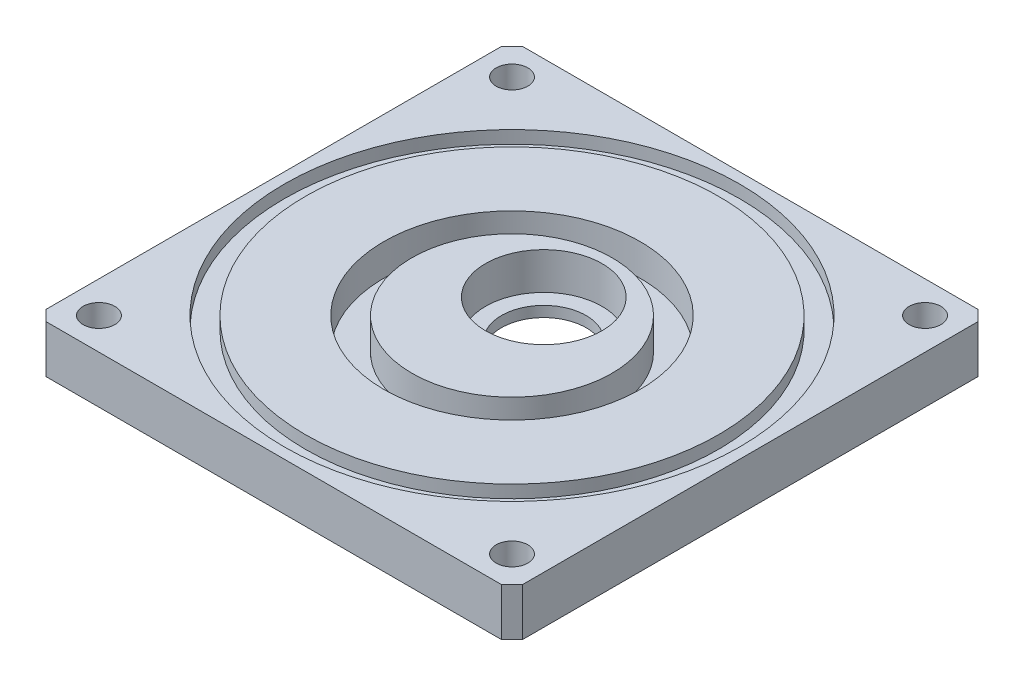
ISO-10303-21;
HEADER;
FILE_DESCRIPTION(('STEP AP214'),'2;1');
FILE_NAME('part.step','',(''),(''),'','','');
FILE_SCHEMA(('AUTOMOTIVE_DESIGN { 1 0 10303 214 1 1 1 1 }'));
ENDSEC;
DATA;
#1=APPLICATION_CONTEXT('core data for automotive mechanical design processes');
#2=APPLICATION_PROTOCOL_DEFINITION('international standard','automotive_design',2000,#1);
#3=PRODUCT_CONTEXT('',#1,'mechanical');
#4=PRODUCT('Part','Part','',(#3));
#5=PRODUCT_RELATED_PRODUCT_CATEGORY('part','',(#4));
#6=PRODUCT_DEFINITION_FORMATION('','',#4);
#7=PRODUCT_DEFINITION_CONTEXT('part definition',#1,'design');
#8=PRODUCT_DEFINITION('design','',#6,#7);
#9=PRODUCT_DEFINITION_SHAPE('','',#8);
#10=(LENGTH_UNIT() NAMED_UNIT(*) SI_UNIT(.MILLI.,.METRE.));
#11=(NAMED_UNIT(*) PLANE_ANGLE_UNIT() SI_UNIT($,.RADIAN.));
#12=(NAMED_UNIT(*) SI_UNIT($,.STERADIAN.) SOLID_ANGLE_UNIT());
#13=UNCERTAINTY_MEASURE_WITH_UNIT(LENGTH_MEASURE(1.E-05),#10,'distance_accuracy_value','');
#14=(GEOMETRIC_REPRESENTATION_CONTEXT(3) GLOBAL_UNCERTAINTY_ASSIGNED_CONTEXT((#13)) GLOBAL_UNIT_ASSIGNED_CONTEXT((#10,
#11,#12)) REPRESENTATION_CONTEXT('',''));
#15=CARTESIAN_POINT('',(0.,0.,0.));
#16=DIRECTION('',(0.,0.,1.));
#17=DIRECTION('',(1.,0.,0.));
#18=AXIS2_PLACEMENT_3D('',#15,#16,#17);
#19=CARTESIAN_POINT('',(0.,4.5,0.));
#20=DIRECTION('',(0.,-1.,0.));
#21=DIRECTION('',(0.,0.,-1.));
#22=AXIS2_PLACEMENT_3D('',#19,#20,#21);
#23=PLANE('',#22);
#24=CARTESIAN_POINT('',(0.,4.5,0.));
#25=DIRECTION('',(0.,1.,0.));
#26=DIRECTION('',(0.,0.,1.));
#27=AXIS2_PLACEMENT_3D('',#24,#25,#26);
#28=CIRCLE('',#27,12.1);
#29=CARTESIAN_POINT('',(0.,4.5,12.1));
#30=VERTEX_POINT('',#29);
#31=EDGE_CURVE('E269',#30,#30,#28,.T.);
#32=ORIENTED_EDGE('',*,*,#31,.F.);
#33=EDGE_LOOP('',(#32));
#34=FACE_BOUND('',#33,.T.);
#35=CARTESIAN_POINT('',(0.,4.5,0.));
#36=DIRECTION('',(0.,1.,0.));
#37=DIRECTION('',(0.,0.,1.));
#38=AXIS2_PLACEMENT_3D('',#35,#36,#37);
#39=CIRCLE('',#38,19.5);
#40=CARTESIAN_POINT('',(0.,4.5,19.5));
#41=VERTEX_POINT('',#40);
#42=EDGE_CURVE('E261',#41,#41,#39,.T.);
#43=ORIENTED_EDGE('',*,*,#42,.T.);
#44=EDGE_LOOP('',(#43));
#45=FACE_BOUND('',#44,.T.);
#46=ADVANCED_FACE('F39',(#34,#45),#23,.F.);
#47=CARTESIAN_POINT('',(0.,4.5,-3.));
#48=DIRECTION('',(0.,1.,0.));
#49=DIRECTION('',(0.,0.,1.));
#50=AXIS2_PLACEMENT_3D('',#47,#48,#49);
#51=CIRCLE('',#50,5.5);
#52=CARTESIAN_POINT('',(0.,4.5,2.5));
#53=VERTEX_POINT('',#52);
#54=EDGE_CURVE('E285',#53,#53,#51,.T.);
#55=ORIENTED_EDGE('',*,*,#54,.F.);
#56=EDGE_LOOP('',(#55));
#57=FACE_BOUND('',#56,.T.);
#58=CARTESIAN_POINT('',(0.,4.5,0.));
#59=DIRECTION('',(0.,1.,0.));
#60=DIRECTION('',(0.,0.,1.));
#61=AXIS2_PLACEMENT_3D('',#58,#59,#60);
#62=CIRCLE('',#61,9.45);
#63=CARTESIAN_POINT('',(0.,4.5,9.45));
#64=VERTEX_POINT('',#63);
#65=EDGE_CURVE('E258',#64,#64,#62,.T.);
#66=ORIENTED_EDGE('',*,*,#65,.T.);
#67=EDGE_LOOP('',(#66));
#68=FACE_BOUND('',#67,.T.);
#69=ADVANCED_FACE('F213',(#57,#68),#23,.F.);
#70=CARTESIAN_POINT('',(22.5,4.5,22.5));
#71=DIRECTION('',(-1.,0.,0.));
#72=DIRECTION('',(0.,0.,1.));
#73=AXIS2_PLACEMENT_3D('',#70,#71,#72);
#74=PLANE('',#73);
#75=DIRECTION('',(0.,0.,-1.));
#76=VECTOR('',#75,1.);
#77=CARTESIAN_POINT('',(22.5,4.5,22.5));
#78=LINE('',#77,#76);
#79=CARTESIAN_POINT('',(22.5,4.5,21.5));
#80=VERTEX_POINT('',#79);
#81=CARTESIAN_POINT('',(22.5,4.5,-21.5));
#82=VERTEX_POINT('',#81);
#83=EDGE_CURVE('E135',#80,#82,#78,.T.);
#84=ORIENTED_EDGE('',*,*,#83,.F.);
#85=DIRECTION('',(0.,-1.,0.));
#86=VECTOR('',#85,1.);
#87=CARTESIAN_POINT('',(22.5,4.5,21.5));
#88=LINE('',#87,#86);
#89=CARTESIAN_POINT('',(22.5,0.,21.5));
#90=VERTEX_POINT('',#89);
#91=EDGE_CURVE('E174',#80,#90,#88,.T.);
#92=ORIENTED_EDGE('',*,*,#91,.T.);
#93=DIRECTION('',(0.,0.,-1.));
#94=VECTOR('',#93,1.);
#95=CARTESIAN_POINT('',(22.5,0.,22.5));
#96=LINE('',#95,#94);
#97=CARTESIAN_POINT('',(22.5,0.,-21.5));
#98=VERTEX_POINT('',#97);
#99=EDGE_CURVE('E189',#90,#98,#96,.T.);
#100=ORIENTED_EDGE('',*,*,#99,.T.);
#101=DIRECTION('',(0.,1.,0.));
#102=VECTOR('',#101,1.);
#103=CARTESIAN_POINT('',(22.5,4.5,-21.5));
#104=LINE('',#103,#102);
#105=EDGE_CURVE('E171',#98,#82,#104,.T.);
#106=ORIENTED_EDGE('',*,*,#105,.T.);
#107=EDGE_LOOP('',(#84,#92,#100,#106));
#108=FACE_BOUND('',#107,.T.);
#109=ADVANCED_FACE('F210',(#108),#74,.F.);
#110=CARTESIAN_POINT('',(-22.5,4.5,-22.5));
#111=DIRECTION('',(0.,0.,1.));
#112=DIRECTION('',(1.,0.,0.));
#113=AXIS2_PLACEMENT_3D('',#110,#111,#112);
#114=PLANE('',#113);
#115=DIRECTION('',(-1.,0.,0.));
#116=VECTOR('',#115,1.);
#117=CARTESIAN_POINT('',(-22.5,4.5,-22.5));
#118=LINE('',#117,#116);
#119=CARTESIAN_POINT('',(21.5,4.5,-22.5));
#120=VERTEX_POINT('',#119);
#121=CARTESIAN_POINT('',(-21.5,4.5,-22.5));
#122=VERTEX_POINT('',#121);
#123=EDGE_CURVE('E140',#120,#122,#118,.T.);
#124=ORIENTED_EDGE('',*,*,#123,.F.);
#125=DIRECTION('',(0.,-1.,0.));
#126=VECTOR('',#125,1.);
#127=CARTESIAN_POINT('',(21.5,4.5,-22.5));
#128=LINE('',#127,#126);
#129=CARTESIAN_POINT('',(21.5,0.,-22.5));
#130=VERTEX_POINT('',#129);
#131=EDGE_CURVE('E11',#120,#130,#128,.T.);
#132=ORIENTED_EDGE('',*,*,#131,.T.);
#133=DIRECTION('',(-1.,0.,0.));
#134=VECTOR('',#133,1.);
#135=CARTESIAN_POINT('',(-22.5,0.,-22.5));
#136=LINE('',#135,#134);
#137=CARTESIAN_POINT('',(-21.5,0.,-22.5));
#138=VERTEX_POINT('',#137);
#139=EDGE_CURVE('E142',#130,#138,#136,.T.);
#140=ORIENTED_EDGE('',*,*,#139,.T.);
#141=DIRECTION('',(0.,1.,0.));
#142=VECTOR('',#141,1.);
#143=CARTESIAN_POINT('',(-21.5,4.5,-22.5));
#144=LINE('',#143,#142);
#145=EDGE_CURVE('E48',#138,#122,#144,.T.);
#146=ORIENTED_EDGE('',*,*,#145,.T.);
#147=EDGE_LOOP('',(#124,#132,#140,#146));
#148=FACE_BOUND('',#147,.T.);
#149=ADVANCED_FACE('F195',(#148),#114,.F.);
#150=CARTESIAN_POINT('',(-22.5,4.5,22.5));
#151=DIRECTION('',(1.,0.,0.));
#152=DIRECTION('',(0.,0.,-1.));
#153=AXIS2_PLACEMENT_3D('',#150,#151,#152);
#154=PLANE('',#153);
#155=DIRECTION('',(0.,0.,1.));
#156=VECTOR('',#155,1.);
#157=CARTESIAN_POINT('',(-22.5,0.,22.5));
#158=LINE('',#157,#156);
#159=CARTESIAN_POINT('',(-22.5,0.,-21.5));
#160=VERTEX_POINT('',#159);
#161=CARTESIAN_POINT('',(-22.5,0.,21.5));
#162=VERTEX_POINT('',#161);
#163=EDGE_CURVE('E136',#160,#162,#158,.T.);
#164=ORIENTED_EDGE('',*,*,#163,.T.);
#165=DIRECTION('',(0.,1.,0.));
#166=VECTOR('',#165,1.);
#167=CARTESIAN_POINT('',(-22.5,4.5,21.5));
#168=LINE('',#167,#166);
#169=CARTESIAN_POINT('',(-22.5,4.5,21.5));
#170=VERTEX_POINT('',#169);
#171=EDGE_CURVE('E111',#162,#170,#168,.T.);
#172=ORIENTED_EDGE('',*,*,#171,.T.);
#173=DIRECTION('',(0.,0.,1.));
#174=VECTOR('',#173,1.);
#175=CARTESIAN_POINT('',(-22.5,4.5,22.5));
#176=LINE('',#175,#174);
#177=CARTESIAN_POINT('',(-22.5,4.5,-21.5));
#178=VERTEX_POINT('',#177);
#179=EDGE_CURVE('E180',#178,#170,#176,.T.);
#180=ORIENTED_EDGE('',*,*,#179,.F.);
#181=DIRECTION('',(0.,-1.,0.));
#182=VECTOR('',#181,1.);
#183=CARTESIAN_POINT('',(-22.5,4.5,-21.5));
#184=LINE('',#183,#182);
#185=EDGE_CURVE('E117',#178,#160,#184,.T.);
#186=ORIENTED_EDGE('',*,*,#185,.T.);
#187=EDGE_LOOP('',(#164,#172,#180,#186));
#188=FACE_BOUND('',#187,.T.);
#189=ADVANCED_FACE('F202',(#188),#154,.F.);
#190=CARTESIAN_POINT('',(-22.5,4.5,22.5));
#191=DIRECTION('',(0.,0.,-1.));
#192=DIRECTION('',(-1.,0.,0.));
#193=AXIS2_PLACEMENT_3D('',#190,#191,#192);
#194=PLANE('',#193);
#195=DIRECTION('',(1.,0.,0.));
#196=VECTOR('',#195,1.);
#197=CARTESIAN_POINT('',(-22.5,4.5,22.5));
#198=LINE('',#197,#196);
#199=CARTESIAN_POINT('',(-21.5,4.5,22.5));
#200=VERTEX_POINT('',#199);
#201=CARTESIAN_POINT('',(21.5,4.5,22.5));
#202=VERTEX_POINT('',#201);
#203=EDGE_CURVE('E127',#200,#202,#198,.T.);
#204=ORIENTED_EDGE('',*,*,#203,.F.);
#205=DIRECTION('',(0.,-1.,0.));
#206=VECTOR('',#205,1.);
#207=CARTESIAN_POINT('',(-21.5,4.5,22.5));
#208=LINE('',#207,#206);
#209=CARTESIAN_POINT('',(-21.5,0.,22.5));
#210=VERTEX_POINT('',#209);
#211=EDGE_CURVE('E110',#200,#210,#208,.T.);
#212=ORIENTED_EDGE('',*,*,#211,.T.);
#213=DIRECTION('',(1.,0.,0.));
#214=VECTOR('',#213,1.);
#215=CARTESIAN_POINT('',(-22.5,0.,22.5));
#216=LINE('',#215,#214);
#217=CARTESIAN_POINT('',(21.5,0.,22.5));
#218=VERTEX_POINT('',#217);
#219=EDGE_CURVE('E124',#210,#218,#216,.T.);
#220=ORIENTED_EDGE('',*,*,#219,.T.);
#221=DIRECTION('',(0.,1.,0.));
#222=VECTOR('',#221,1.);
#223=CARTESIAN_POINT('',(21.5,4.5,22.5));
#224=LINE('',#223,#222);
#225=EDGE_CURVE('E130',#218,#202,#224,.T.);
#226=ORIENTED_EDGE('',*,*,#225,.T.);
#227=EDGE_LOOP('',(#204,#212,#220,#226));
#228=FACE_BOUND('',#227,.T.);
#229=ADVANCED_FACE('F123',(#228),#194,.F.);
#230=CARTESIAN_POINT('',(-19.5,4.5,-19.5));
#231=DIRECTION('',(0.,-1.,0.));
#232=DIRECTION('',(0.,0.,1.));
#233=AXIS2_PLACEMENT_3D('',#230,#231,#232);
#234=CIRCLE('',#233,1.5);
#235=CARTESIAN_POINT('',(-19.5,4.5,-18.));
#236=VERTEX_POINT('',#235);
#237=EDGE_CURVE('E234',#236,#236,#234,.T.);
#238=ORIENTED_EDGE('',*,*,#237,.T.);
#239=EDGE_LOOP('',(#238));
#240=FACE_BOUND('',#239,.T.);
#241=CARTESIAN_POINT('',(19.5,4.5,-19.5));
#242=DIRECTION('',(0.,-1.,0.));
#243=DIRECTION('',(0.,0.,-1.));
#244=AXIS2_PLACEMENT_3D('',#241,#242,#243);
#245=CIRCLE('',#244,1.5);
#246=CARTESIAN_POINT('',(19.5,4.5,-21.));
#247=VERTEX_POINT('',#246);
#248=EDGE_CURVE('E238',#247,#247,#245,.T.);
#249=ORIENTED_EDGE('',*,*,#248,.T.);
#250=EDGE_LOOP('',(#249));
#251=FACE_BOUND('',#250,.T.);
#252=CARTESIAN_POINT('',(19.5,4.5,19.5));
#253=DIRECTION('',(0.,-1.,0.));
#254=DIRECTION('',(0.,0.,1.));
#255=AXIS2_PLACEMENT_3D('',#252,#253,#254);
#256=CIRCLE('',#255,1.5);
#257=CARTESIAN_POINT('',(19.5,4.5,21.));
#258=VERTEX_POINT('',#257);
#259=EDGE_CURVE('E242',#258,#258,#256,.T.);
#260=ORIENTED_EDGE('',*,*,#259,.T.);
#261=EDGE_LOOP('',(#260));
#262=FACE_BOUND('',#261,.T.);
#263=CARTESIAN_POINT('',(-19.5,4.5,19.5));
#264=DIRECTION('',(0.,-1.,0.));
#265=DIRECTION('',(0.,0.,-1.));
#266=AXIS2_PLACEMENT_3D('',#263,#264,#265);
#267=CIRCLE('',#266,1.5);
#268=CARTESIAN_POINT('',(-19.5,4.5,18.));
#269=VERTEX_POINT('',#268);
#270=EDGE_CURVE('E246',#269,#269,#267,.T.);
#271=ORIENTED_EDGE('',*,*,#270,.T.);
#272=EDGE_LOOP('',(#271));
#273=FACE_BOUND('',#272,.T.);
#274=CARTESIAN_POINT('',(0.,4.5,0.));
#275=DIRECTION('',(0.,1.,0.));
#276=DIRECTION('',(0.,0.,1.));
#277=AXIS2_PLACEMENT_3D('',#274,#275,#276);
#278=CIRCLE('',#277,21.5);
#279=CARTESIAN_POINT('',(0.,4.5,21.5));
#280=VERTEX_POINT('',#279);
#281=EDGE_CURVE('E249',#280,#280,#278,.T.);
#282=ORIENTED_EDGE('',*,*,#281,.F.);
#283=EDGE_LOOP('',(#282));
#284=FACE_BOUND('',#283,.T.);
#285=ORIENTED_EDGE('',*,*,#179,.T.);
#286=DIRECTION('',(-0.707106781186545,0.,-0.70710678118655));
#287=VECTOR('',#286,1.);
#288=CARTESIAN_POINT('',(-21.5,4.5,22.5));
#289=LINE('',#288,#287);
#290=EDGE_CURVE('E168',#170,#200,#289,.F.);
#291=ORIENTED_EDGE('',*,*,#290,.T.);
#292=ORIENTED_EDGE('',*,*,#203,.T.);
#293=DIRECTION('',(-0.70710678118655,0.,0.707106781186545));
#294=VECTOR('',#293,1.);
#295=CARTESIAN_POINT('',(22.5,4.5,21.5));
#296=LINE('',#295,#294);
#297=EDGE_CURVE('E165',#202,#80,#296,.F.);
#298=ORIENTED_EDGE('',*,*,#297,.T.);
#299=ORIENTED_EDGE('',*,*,#83,.T.);
#300=DIRECTION('',(0.707106781186545,0.,0.70710678118655));
#301=VECTOR('',#300,1.);
#302=CARTESIAN_POINT('',(21.5,4.5,-22.5));
#303=LINE('',#302,#301);
#304=EDGE_CURVE('E61',#82,#120,#303,.F.);
#305=ORIENTED_EDGE('',*,*,#304,.T.);
#306=ORIENTED_EDGE('',*,*,#123,.T.);
#307=DIRECTION('',(0.70710678118655,0.,-0.707106781186545));
#308=VECTOR('',#307,1.);
#309=CARTESIAN_POINT('',(-22.5,4.5,-21.5));
#310=LINE('',#309,#308);
#311=EDGE_CURVE('E160',#122,#178,#310,.F.);
#312=ORIENTED_EDGE('',*,*,#311,.T.);
#313=EDGE_LOOP('',(#285,#291,#292,#298,#299,#305,#306,#312));
#314=FACE_BOUND('',#313,.T.);
#315=ADVANCED_FACE('F200',(#240,#251,#262,#273,#284,#314),#23,.F.);
#316=CARTESIAN_POINT('',(0.,0.,0.));
#317=DIRECTION('',(0.,-1.,0.));
#318=DIRECTION('',(0.,0.,-1.));
#319=AXIS2_PLACEMENT_3D('',#316,#317,#318);
#320=PLANE('',#319);
#321=CARTESIAN_POINT('',(-19.5,0.,-19.5));
#322=DIRECTION('',(0.,-1.,0.));
#323=DIRECTION('',(0.,0.,1.));
#324=AXIS2_PLACEMENT_3D('',#321,#322,#323);
#325=CIRCLE('',#324,1.5);
#326=CARTESIAN_POINT('',(-19.5,0.,-18.));
#327=VERTEX_POINT('',#326);
#328=EDGE_CURVE('E497',#327,#327,#325,.T.);
#329=ORIENTED_EDGE('',*,*,#328,.F.);
#330=EDGE_LOOP('',(#329));
#331=FACE_BOUND('',#330,.T.);
#332=CARTESIAN_POINT('',(19.5,0.,-19.5));
#333=DIRECTION('',(0.,-1.,0.));
#334=DIRECTION('',(0.,0.,-1.));
#335=AXIS2_PLACEMENT_3D('',#332,#333,#334);
#336=CIRCLE('',#335,1.5);
#337=CARTESIAN_POINT('',(19.5,0.,-21.));
#338=VERTEX_POINT('',#337);
#339=EDGE_CURVE('E501',#338,#338,#336,.T.);
#340=ORIENTED_EDGE('',*,*,#339,.F.);
#341=EDGE_LOOP('',(#340));
#342=FACE_BOUND('',#341,.T.);
#343=CARTESIAN_POINT('',(19.5,0.,19.5));
#344=DIRECTION('',(0.,-1.,0.));
#345=DIRECTION('',(0.,0.,1.));
#346=AXIS2_PLACEMENT_3D('',#343,#344,#345);
#347=CIRCLE('',#346,1.5);
#348=CARTESIAN_POINT('',(19.5,0.,21.));
#349=VERTEX_POINT('',#348);
#350=EDGE_CURVE('E516',#349,#349,#347,.T.);
#351=ORIENTED_EDGE('',*,*,#350,.F.);
#352=EDGE_LOOP('',(#351));
#353=FACE_BOUND('',#352,.T.);
#354=CARTESIAN_POINT('',(-19.5,0.,19.5));
#355=DIRECTION('',(0.,-1.,0.));
#356=DIRECTION('',(0.,0.,-1.));
#357=AXIS2_PLACEMENT_3D('',#354,#355,#356);
#358=CIRCLE('',#357,1.5);
#359=CARTESIAN_POINT('',(-19.5,0.,18.));
#360=VERTEX_POINT('',#359);
#361=EDGE_CURVE('E507',#360,#360,#358,.T.);
#362=ORIENTED_EDGE('',*,*,#361,.F.);
#363=EDGE_LOOP('',(#362));
#364=FACE_BOUND('',#363,.T.);
#365=CARTESIAN_POINT('',(0.,0.,-3.));
#366=DIRECTION('',(0.,1.,0.));
#367=DIRECTION('',(0.,0.,1.));
#368=AXIS2_PLACEMENT_3D('',#365,#366,#367);
#369=CIRCLE('',#368,4.);
#370=CARTESIAN_POINT('',(0.,0.,1.));
#371=VERTEX_POINT('',#370);
#372=EDGE_CURVE('E281',#371,#371,#369,.T.);
#373=ORIENTED_EDGE('',*,*,#372,.T.);
#374=EDGE_LOOP('',(#373));
#375=FACE_BOUND('',#374,.T.);
#376=ORIENTED_EDGE('',*,*,#219,.F.);
#377=DIRECTION('',(0.707106781186545,0.,0.70710678118655));
#378=VECTOR('',#377,1.);
#379=CARTESIAN_POINT('',(-22.0000000000001,0.,21.9999999999999));
#380=LINE('',#379,#378);
#381=EDGE_CURVE('E106',#210,#162,#380,.F.);
#382=ORIENTED_EDGE('',*,*,#381,.T.);
#383=ORIENTED_EDGE('',*,*,#163,.F.);
#384=DIRECTION('',(-0.70710678118655,0.,0.707106781186545));
#385=VECTOR('',#384,1.);
#386=CARTESIAN_POINT('',(-21.9999999999999,0.,-22.0000000000001));
#387=LINE('',#386,#385);
#388=EDGE_CURVE('E129',#160,#138,#387,.F.);
#389=ORIENTED_EDGE('',*,*,#388,.T.);
#390=ORIENTED_EDGE('',*,*,#139,.F.);
#391=DIRECTION('',(-0.707106781186545,0.,-0.70710678118655));
#392=VECTOR('',#391,1.);
#393=CARTESIAN_POINT('',(22.0000000000001,0.,-21.9999999999999));
#394=LINE('',#393,#392);
#395=EDGE_CURVE('E150',#130,#98,#394,.F.);
#396=ORIENTED_EDGE('',*,*,#395,.T.);
#397=ORIENTED_EDGE('',*,*,#99,.F.);
#398=DIRECTION('',(0.70710678118655,0.,-0.707106781186545));
#399=VECTOR('',#398,1.);
#400=CARTESIAN_POINT('',(21.9999999999999,0.,22.0000000000001));
#401=LINE('',#400,#399);
#402=EDGE_CURVE('E118',#90,#218,#401,.F.);
#403=ORIENTED_EDGE('',*,*,#402,.T.);
#404=EDGE_LOOP('',(#376,#382,#383,#389,#390,#396,#397,#403));
#405=FACE_BOUND('',#404,.T.);
#406=ADVANCED_FACE('F132',(#331,#342,#353,#364,#375,#405),#320,.T.);
#407=CARTESIAN_POINT('',(0.,1.,-3.));
#408=DIRECTION('',(0.,1.,0.));
#409=DIRECTION('',(0.,0.,1.));
#410=AXIS2_PLACEMENT_3D('',#407,#408,#409);
#411=CYLINDRICAL_SURFACE('',#410,5.5);
#412=CARTESIAN_POINT('',(0.,1.,-3.));
#413=DIRECTION('',(0.,1.,0.));
#414=DIRECTION('',(0.,0.,1.));
#415=AXIS2_PLACEMENT_3D('',#412,#413,#414);
#416=CIRCLE('',#415,5.5);
#417=CARTESIAN_POINT('',(0.,1.,2.5));
#418=VERTEX_POINT('',#417);
#419=EDGE_CURVE('E192',#418,#418,#416,.T.);
#420=ORIENTED_EDGE('',*,*,#419,.F.);
#421=EDGE_LOOP('',(#420));
#422=FACE_BOUND('',#421,.T.);
#423=ORIENTED_EDGE('',*,*,#54,.T.);
#424=EDGE_LOOP('',(#423));
#425=FACE_BOUND('',#424,.T.);
#426=ADVANCED_FACE('F229',(#422,#425),#411,.F.);
#427=CARTESIAN_POINT('',(0.,1.,-3.));
#428=DIRECTION('',(0.,1.,0.));
#429=DIRECTION('',(0.,0.,1.));
#430=AXIS2_PLACEMENT_3D('',#427,#428,#429);
#431=PLANE('',#430);
#432=CARTESIAN_POINT('',(0.,1.,-3.));
#433=DIRECTION('',(0.,1.,0.));
#434=DIRECTION('',(0.,0.,1.));
#435=AXIS2_PLACEMENT_3D('',#432,#433,#434);
#436=CIRCLE('',#435,4.);
#437=CARTESIAN_POINT('',(0.,1.,1.));
#438=VERTEX_POINT('',#437);
#439=EDGE_CURVE('E277',#438,#438,#436,.T.);
#440=ORIENTED_EDGE('',*,*,#439,.F.);
#441=EDGE_LOOP('',(#440));
#442=FACE_BOUND('',#441,.T.);
#443=ORIENTED_EDGE('',*,*,#419,.T.);
#444=EDGE_LOOP('',(#443));
#445=FACE_BOUND('',#444,.T.);
#446=ADVANCED_FACE('F322',(#442,#445),#431,.T.);
#447=CARTESIAN_POINT('',(0.,0.,-3.));
#448=DIRECTION('',(0.,1.,0.));
#449=DIRECTION('',(0.,0.,1.));
#450=AXIS2_PLACEMENT_3D('',#447,#448,#449);
#451=CYLINDRICAL_SURFACE('',#450,4.);
#452=ORIENTED_EDGE('',*,*,#372,.F.);
#453=EDGE_LOOP('',(#452));
#454=FACE_BOUND('',#453,.T.);
#455=ORIENTED_EDGE('',*,*,#439,.T.);
#456=EDGE_LOOP('',(#455));
#457=FACE_BOUND('',#456,.T.);
#458=ADVANCED_FACE('F318',(#454,#457),#451,.F.);
#459=CARTESIAN_POINT('',(0.,1.5,0.));
#460=DIRECTION('',(0.,1.,0.));
#461=DIRECTION('',(0.,0.,1.));
#462=AXIS2_PLACEMENT_3D('',#459,#460,#461);
#463=CYLINDRICAL_SURFACE('',#462,12.1);
#464=CARTESIAN_POINT('',(0.,1.5,0.));
#465=DIRECTION('',(0.,1.,0.));
#466=DIRECTION('',(0.,0.,1.));
#467=AXIS2_PLACEMENT_3D('',#464,#465,#466);
#468=CIRCLE('',#467,12.1);
#469=CARTESIAN_POINT('',(0.,1.5,12.1));
#470=VERTEX_POINT('',#469);
#471=EDGE_CURVE('E273',#470,#470,#468,.T.);
#472=ORIENTED_EDGE('',*,*,#471,.F.);
#473=EDGE_LOOP('',(#472));
#474=FACE_BOUND('',#473,.T.);
#475=ORIENTED_EDGE('',*,*,#31,.T.);
#476=EDGE_LOOP('',(#475));
#477=FACE_BOUND('',#476,.T.);
#478=ADVANCED_FACE('F311',(#474,#477),#463,.F.);
#479=CARTESIAN_POINT('',(0.,1.5,0.));
#480=DIRECTION('',(0.,1.,0.));
#481=DIRECTION('',(0.,0.,1.));
#482=AXIS2_PLACEMENT_3D('',#479,#480,#481);
#483=PLANE('',#482);
#484=CARTESIAN_POINT('',(0.,1.5,0.));
#485=DIRECTION('',(0.,1.,0.));
#486=DIRECTION('',(0.,0.,1.));
#487=AXIS2_PLACEMENT_3D('',#484,#485,#486);
#488=CIRCLE('',#487,9.45);
#489=CARTESIAN_POINT('',(0.,1.5,9.45));
#490=VERTEX_POINT('',#489);
#491=EDGE_CURVE('E265',#490,#490,#488,.T.);
#492=ORIENTED_EDGE('',*,*,#491,.F.);
#493=EDGE_LOOP('',(#492));
#494=FACE_BOUND('',#493,.T.);
#495=ORIENTED_EDGE('',*,*,#471,.T.);
#496=EDGE_LOOP('',(#495));
#497=FACE_BOUND('',#496,.T.);
#498=ADVANCED_FACE('F301',(#494,#497),#483,.T.);
#499=CARTESIAN_POINT('',(0.,1.5,0.));
#500=DIRECTION('',(0.,1.,0.));
#501=DIRECTION('',(0.,0.,1.));
#502=AXIS2_PLACEMENT_3D('',#499,#500,#501);
#503=CYLINDRICAL_SURFACE('',#502,9.45);
#504=ORIENTED_EDGE('',*,*,#491,.T.);
#505=EDGE_LOOP('',(#504));
#506=FACE_BOUND('',#505,.T.);
#507=ORIENTED_EDGE('',*,*,#65,.F.);
#508=EDGE_LOOP('',(#507));
#509=FACE_BOUND('',#508,.T.);
#510=ADVANCED_FACE('F298',(#506,#509),#503,.T.);
#511=CARTESIAN_POINT('',(0.,3.3,0.));
#512=DIRECTION('',(0.,1.,0.));
#513=DIRECTION('',(0.,0.,1.));
#514=AXIS2_PLACEMENT_3D('',#511,#512,#513);
#515=CYLINDRICAL_SURFACE('',#514,21.5);
#516=CARTESIAN_POINT('',(0.,3.3,0.));
#517=DIRECTION('',(0.,1.,0.));
#518=DIRECTION('',(0.,0.,1.));
#519=AXIS2_PLACEMENT_3D('',#516,#517,#518);
#520=CIRCLE('',#519,21.5);
#521=CARTESIAN_POINT('',(0.,3.3,21.5));
#522=VERTEX_POINT('',#521);
#523=EDGE_CURVE('E252',#522,#522,#520,.T.);
#524=ORIENTED_EDGE('',*,*,#523,.F.);
#525=EDGE_LOOP('',(#524));
#526=FACE_BOUND('',#525,.T.);
#527=ORIENTED_EDGE('',*,*,#281,.T.);
#528=EDGE_LOOP('',(#527));
#529=FACE_BOUND('',#528,.T.);
#530=ADVANCED_FACE('F300',(#526,#529),#515,.F.);
#531=CARTESIAN_POINT('',(0.,3.3,0.));
#532=DIRECTION('',(0.,1.,0.));
#533=DIRECTION('',(0.,0.,1.));
#534=AXIS2_PLACEMENT_3D('',#531,#532,#533);
#535=PLANE('',#534);
#536=CARTESIAN_POINT('',(0.,3.3,0.));
#537=DIRECTION('',(0.,1.,0.));
#538=DIRECTION('',(0.,0.,1.));
#539=AXIS2_PLACEMENT_3D('',#536,#537,#538);
#540=CIRCLE('',#539,19.5);
#541=CARTESIAN_POINT('',(0.,3.3,19.5));
#542=VERTEX_POINT('',#541);
#543=EDGE_CURVE('E253',#542,#542,#540,.T.);
#544=ORIENTED_EDGE('',*,*,#543,.F.);
#545=EDGE_LOOP('',(#544));
#546=FACE_BOUND('',#545,.T.);
#547=ORIENTED_EDGE('',*,*,#523,.T.);
#548=EDGE_LOOP('',(#547));
#549=FACE_BOUND('',#548,.T.);
#550=ADVANCED_FACE('F308',(#546,#549),#535,.T.);
#551=CARTESIAN_POINT('',(0.,3.3,0.));
#552=DIRECTION('',(0.,1.,0.));
#553=DIRECTION('',(0.,0.,1.));
#554=AXIS2_PLACEMENT_3D('',#551,#552,#553);
#555=CYLINDRICAL_SURFACE('',#554,19.5);
#556=ORIENTED_EDGE('',*,*,#543,.T.);
#557=EDGE_LOOP('',(#556));
#558=FACE_BOUND('',#557,.T.);
#559=ORIENTED_EDGE('',*,*,#42,.F.);
#560=EDGE_LOOP('',(#559));
#561=FACE_BOUND('',#560,.T.);
#562=ADVANCED_FACE('F374',(#558,#561),#555,.T.);
#563=CARTESIAN_POINT('',(-21.5,4.5,22.5));
#564=DIRECTION('',(0.70710678118655,0.,-0.707106781186545));
#565=DIRECTION('',(0.,-1.,0.));
#566=AXIS2_PLACEMENT_3D('',#563,#564,#565);
#567=PLANE('',#566);
#568=ORIENTED_EDGE('',*,*,#290,.F.);
#569=ORIENTED_EDGE('',*,*,#171,.F.);
#570=ORIENTED_EDGE('',*,*,#381,.F.);
#571=ORIENTED_EDGE('',*,*,#211,.F.);
#572=EDGE_LOOP('',(#568,#569,#570,#571));
#573=FACE_BOUND('',#572,.T.);
#574=ADVANCED_FACE('F109',(#573),#567,.F.);
#575=CARTESIAN_POINT('',(22.5,4.5,21.5));
#576=DIRECTION('',(-0.707106781186545,0.,-0.70710678118655));
#577=DIRECTION('',(0.,-1.,0.));
#578=AXIS2_PLACEMENT_3D('',#575,#576,#577);
#579=PLANE('',#578);
#580=ORIENTED_EDGE('',*,*,#297,.F.);
#581=ORIENTED_EDGE('',*,*,#225,.F.);
#582=ORIENTED_EDGE('',*,*,#402,.F.);
#583=ORIENTED_EDGE('',*,*,#91,.F.);
#584=EDGE_LOOP('',(#580,#581,#582,#583));
#585=FACE_BOUND('',#584,.T.);
#586=ADVANCED_FACE('F418',(#585),#579,.F.);
#587=CARTESIAN_POINT('',(21.5,4.5,-22.5));
#588=DIRECTION('',(-0.70710678118655,0.,0.707106781186545));
#589=DIRECTION('',(0.,-1.,0.));
#590=AXIS2_PLACEMENT_3D('',#587,#588,#589);
#591=PLANE('',#590);
#592=ORIENTED_EDGE('',*,*,#304,.F.);
#593=ORIENTED_EDGE('',*,*,#105,.F.);
#594=ORIENTED_EDGE('',*,*,#395,.F.);
#595=ORIENTED_EDGE('',*,*,#131,.F.);
#596=EDGE_LOOP('',(#592,#593,#594,#595));
#597=FACE_BOUND('',#596,.T.);
#598=ADVANCED_FACE('F427',(#597),#591,.F.);
#599=CARTESIAN_POINT('',(-22.5,4.5,-21.5));
#600=DIRECTION('',(0.707106781186545,0.,0.70710678118655));
#601=DIRECTION('',(0.,-1.,0.));
#602=AXIS2_PLACEMENT_3D('',#599,#600,#601);
#603=PLANE('',#602);
#604=ORIENTED_EDGE('',*,*,#311,.F.);
#605=ORIENTED_EDGE('',*,*,#145,.F.);
#606=ORIENTED_EDGE('',*,*,#388,.F.);
#607=ORIENTED_EDGE('',*,*,#185,.F.);
#608=EDGE_LOOP('',(#604,#605,#606,#607));
#609=FACE_BOUND('',#608,.T.);
#610=ADVANCED_FACE('F41',(#609),#603,.F.);
#611=CARTESIAN_POINT('',(-19.5,4.5,19.5));
#612=DIRECTION('',(0.,-1.,0.));
#613=DIRECTION('',(0.,0.,-1.));
#614=AXIS2_PLACEMENT_3D('',#611,#612,#613);
#615=CYLINDRICAL_SURFACE('',#614,1.5);
#616=ORIENTED_EDGE('',*,*,#270,.F.);
#617=EDGE_LOOP('',(#616));
#618=FACE_BOUND('',#617,.T.);
#619=ORIENTED_EDGE('',*,*,#361,.T.);
#620=EDGE_LOOP('',(#619));
#621=FACE_BOUND('',#620,.T.);
#622=ADVANCED_FACE('F444',(#618,#621),#615,.F.);
#623=CARTESIAN_POINT('',(19.5,4.5,19.5));
#624=DIRECTION('',(0.,-1.,0.));
#625=DIRECTION('',(0.,0.,-1.));
#626=AXIS2_PLACEMENT_3D('',#623,#624,#625);
#627=CYLINDRICAL_SURFACE('',#626,1.5);
#628=ORIENTED_EDGE('',*,*,#259,.F.);
#629=EDGE_LOOP('',(#628));
#630=FACE_BOUND('',#629,.T.);
#631=ORIENTED_EDGE('',*,*,#350,.T.);
#632=EDGE_LOOP('',(#631));
#633=FACE_BOUND('',#632,.T.);
#634=ADVANCED_FACE('F460',(#630,#633),#627,.F.);
#635=CARTESIAN_POINT('',(19.5,4.5,-19.5));
#636=DIRECTION('',(0.,-1.,0.));
#637=DIRECTION('',(0.,0.,-1.));
#638=AXIS2_PLACEMENT_3D('',#635,#636,#637);
#639=CYLINDRICAL_SURFACE('',#638,1.5);
#640=ORIENTED_EDGE('',*,*,#248,.F.);
#641=EDGE_LOOP('',(#640));
#642=FACE_BOUND('',#641,.T.);
#643=ORIENTED_EDGE('',*,*,#339,.T.);
#644=EDGE_LOOP('',(#643));
#645=FACE_BOUND('',#644,.T.);
#646=ADVANCED_FACE('F470',(#642,#645),#639,.F.);
#647=CARTESIAN_POINT('',(-19.5,4.5,-19.5));
#648=DIRECTION('',(0.,-1.,0.));
#649=DIRECTION('',(0.,0.,-1.));
#650=AXIS2_PLACEMENT_3D('',#647,#648,#649);
#651=CYLINDRICAL_SURFACE('',#650,1.5);
#652=ORIENTED_EDGE('',*,*,#237,.F.);
#653=EDGE_LOOP('',(#652));
#654=FACE_BOUND('',#653,.T.);
#655=ORIENTED_EDGE('',*,*,#328,.T.);
#656=EDGE_LOOP('',(#655));
#657=FACE_BOUND('',#656,.T.);
#658=ADVANCED_FACE('F480',(#654,#657),#651,.F.);
#659=CLOSED_SHELL('',(#46,#69,#109,#149,#189,#229,#315,#406,#426,#446,#458,#478,#498,#510,#530,
#550,#562,#574,#586,#598,#610,#622,#634,#646,#658));
#660=MANIFOLD_SOLID_BREP('B2',#659);
#661=ADVANCED_BREP_SHAPE_REPRESENTATION('',(#18,#660),#14);
#662=SHAPE_DEFINITION_REPRESENTATION(#9,#661);
ENDSEC;
END-ISO-10303-21;
